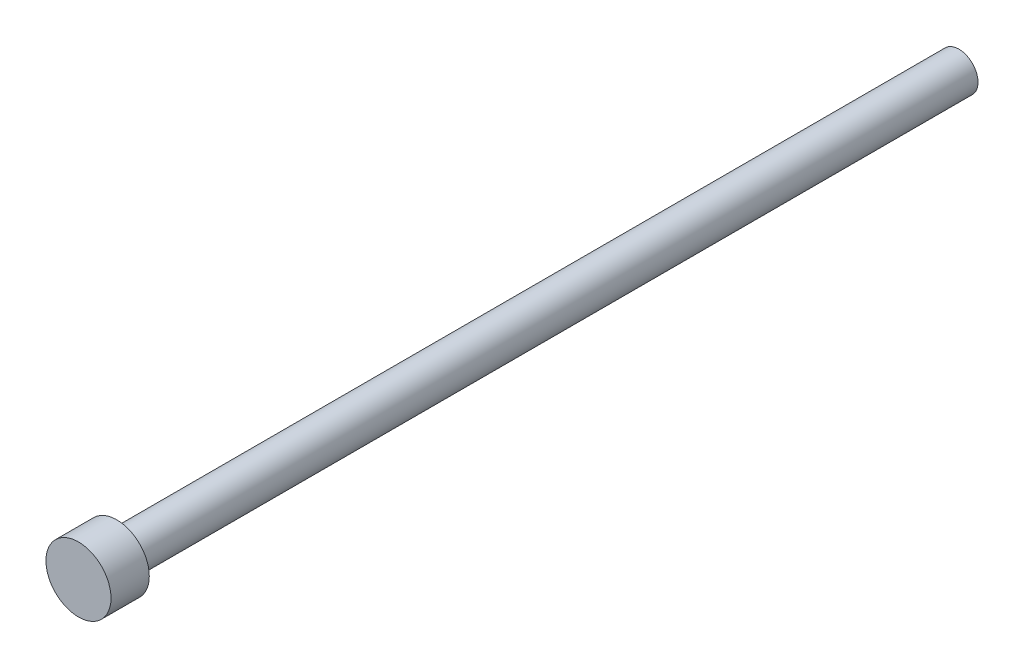
ISO-10303-21;
HEADER;
FILE_DESCRIPTION(('STEP AP214'),'2;1');
FILE_NAME('part.step','',(''),(''),'','','');
FILE_SCHEMA(('AUTOMOTIVE_DESIGN { 1 0 10303 214 1 1 1 1 }'));
ENDSEC;
DATA;
#1=APPLICATION_CONTEXT('core data for automotive mechanical design processes');
#2=APPLICATION_PROTOCOL_DEFINITION('international standard','automotive_design',2000,#1);
#3=PRODUCT_CONTEXT('',#1,'mechanical');
#4=PRODUCT('Part','Part','',(#3));
#5=PRODUCT_RELATED_PRODUCT_CATEGORY('part','',(#4));
#6=PRODUCT_DEFINITION_FORMATION('','',#4);
#7=PRODUCT_DEFINITION_CONTEXT('part definition',#1,'design');
#8=PRODUCT_DEFINITION('design','',#6,#7);
#9=PRODUCT_DEFINITION_SHAPE('','',#8);
#10=(LENGTH_UNIT() NAMED_UNIT(*) SI_UNIT(.MILLI.,.METRE.));
#11=(NAMED_UNIT(*) PLANE_ANGLE_UNIT() SI_UNIT($,.RADIAN.));
#12=(NAMED_UNIT(*) SI_UNIT($,.STERADIAN.) SOLID_ANGLE_UNIT());
#13=UNCERTAINTY_MEASURE_WITH_UNIT(LENGTH_MEASURE(1.E-05),#10,'distance_accuracy_value','');
#14=(GEOMETRIC_REPRESENTATION_CONTEXT(3) GLOBAL_UNCERTAINTY_ASSIGNED_CONTEXT((#13)) GLOBAL_UNIT_ASSIGNED_CONTEXT((#10,
#11,#12)) REPRESENTATION_CONTEXT('',''));
#15=CARTESIAN_POINT('',(0.,0.,0.));
#16=DIRECTION('',(0.,0.,1.));
#17=DIRECTION('',(1.,0.,0.));
#18=AXIS2_PLACEMENT_3D('',#15,#16,#17);
#19=CARTESIAN_POINT('',(0.,0.,110.));
#20=DIRECTION('',(0.,0.,-1.));
#21=DIRECTION('',(-1.,0.,0.));
#22=AXIS2_PLACEMENT_3D('',#19,#20,#21);
#23=CYLINDRICAL_SURFACE('',#22,2.5);
#24=CARTESIAN_POINT('',(0.,0.,110.));
#25=DIRECTION('',(0.,0.,1.));
#26=DIRECTION('',(1.,0.,0.));
#27=AXIS2_PLACEMENT_3D('',#24,#25,#26);
#28=CIRCLE('',#27,2.5);
#29=CARTESIAN_POINT('',(2.5,0.,110.));
#30=VERTEX_POINT('',#29);
#31=EDGE_CURVE('E10',#30,#30,#28,.T.);
#32=ORIENTED_EDGE('',*,*,#31,.F.);
#33=EDGE_LOOP('',(#32));
#34=FACE_BOUND('',#33,.T.);
#35=CARTESIAN_POINT('',(0.,0.,0.));
#36=DIRECTION('',(0.,0.,1.));
#37=DIRECTION('',(1.,0.,0.));
#38=AXIS2_PLACEMENT_3D('',#35,#36,#37);
#39=CIRCLE('',#38,2.5);
#40=CARTESIAN_POINT('',(2.5,0.,0.));
#41=VERTEX_POINT('',#40);
#42=EDGE_CURVE('E42',#41,#41,#39,.T.);
#43=ORIENTED_EDGE('',*,*,#42,.T.);
#44=EDGE_LOOP('',(#43));
#45=FACE_BOUND('',#44,.T.);
#46=ADVANCED_FACE('F39',(#34,#45),#23,.T.);
#47=CARTESIAN_POINT('',(0.,0.,0.));
#48=DIRECTION('',(0.,0.,1.));
#49=DIRECTION('',(1.,0.,0.));
#50=AXIS2_PLACEMENT_3D('',#47,#48,#49);
#51=PLANE('',#50);
#52=ORIENTED_EDGE('',*,*,#42,.F.);
#53=EDGE_LOOP('',(#52));
#54=FACE_BOUND('',#53,.T.);
#55=ADVANCED_FACE('F66',(#54),#51,.F.);
#56=CARTESIAN_POINT('',(0.,0.,115.));
#57=DIRECTION('',(0.,0.,-1.));
#58=DIRECTION('',(-1.,0.,0.));
#59=AXIS2_PLACEMENT_3D('',#56,#57,#58);
#60=CYLINDRICAL_SURFACE('',#59,4.25);
#61=CARTESIAN_POINT('',(0.,0.,115.));
#62=DIRECTION('',(0.,0.,1.));
#63=DIRECTION('',(1.,0.,0.));
#64=AXIS2_PLACEMENT_3D('',#61,#62,#63);
#65=CIRCLE('',#64,4.25);
#66=CARTESIAN_POINT('',(4.25,0.,115.));
#67=VERTEX_POINT('',#66);
#68=EDGE_CURVE('E51',#67,#67,#65,.T.);
#69=ORIENTED_EDGE('',*,*,#68,.F.);
#70=EDGE_LOOP('',(#69));
#71=FACE_BOUND('',#70,.T.);
#72=CARTESIAN_POINT('',(0.,0.,110.));
#73=DIRECTION('',(0.,0.,1.));
#74=DIRECTION('',(1.,0.,0.));
#75=AXIS2_PLACEMENT_3D('',#72,#73,#74);
#76=CIRCLE('',#75,4.25);
#77=CARTESIAN_POINT('',(4.25,0.,110.));
#78=VERTEX_POINT('',#77);
#79=EDGE_CURVE('E53',#78,#78,#76,.T.);
#80=ORIENTED_EDGE('',*,*,#79,.T.);
#81=EDGE_LOOP('',(#80));
#82=FACE_BOUND('',#81,.T.);
#83=ADVANCED_FACE('F63',(#71,#82),#60,.T.);
#84=CARTESIAN_POINT('',(0.,0.,115.));
#85=DIRECTION('',(0.,0.,1.));
#86=DIRECTION('',(1.,0.,0.));
#87=AXIS2_PLACEMENT_3D('',#84,#85,#86);
#88=PLANE('',#87);
#89=ORIENTED_EDGE('',*,*,#68,.T.);
#90=EDGE_LOOP('',(#89));
#91=FACE_BOUND('',#90,.T.);
#92=ADVANCED_FACE('F61',(#91),#88,.T.);
#93=CARTESIAN_POINT('',(0.,0.,110.));
#94=DIRECTION('',(0.,0.,1.));
#95=DIRECTION('',(1.,0.,0.));
#96=AXIS2_PLACEMENT_3D('',#93,#94,#95);
#97=PLANE('',#96);
#98=ORIENTED_EDGE('',*,*,#31,.T.);
#99=EDGE_LOOP('',(#98));
#100=FACE_BOUND('',#99,.T.);
#101=ORIENTED_EDGE('',*,*,#79,.F.);
#102=EDGE_LOOP('',(#101));
#103=FACE_BOUND('',#102,.T.);
#104=ADVANCED_FACE('F70',(#100,#103),#97,.F.);
#105=CLOSED_SHELL('',(#46,#55,#83,#92,#104));
#106=MANIFOLD_SOLID_BREP('B2',#105);
#107=ADVANCED_BREP_SHAPE_REPRESENTATION('',(#18,#106),#14);
#108=SHAPE_DEFINITION_REPRESENTATION(#9,#107);
ENDSEC;
END-ISO-10303-21;
